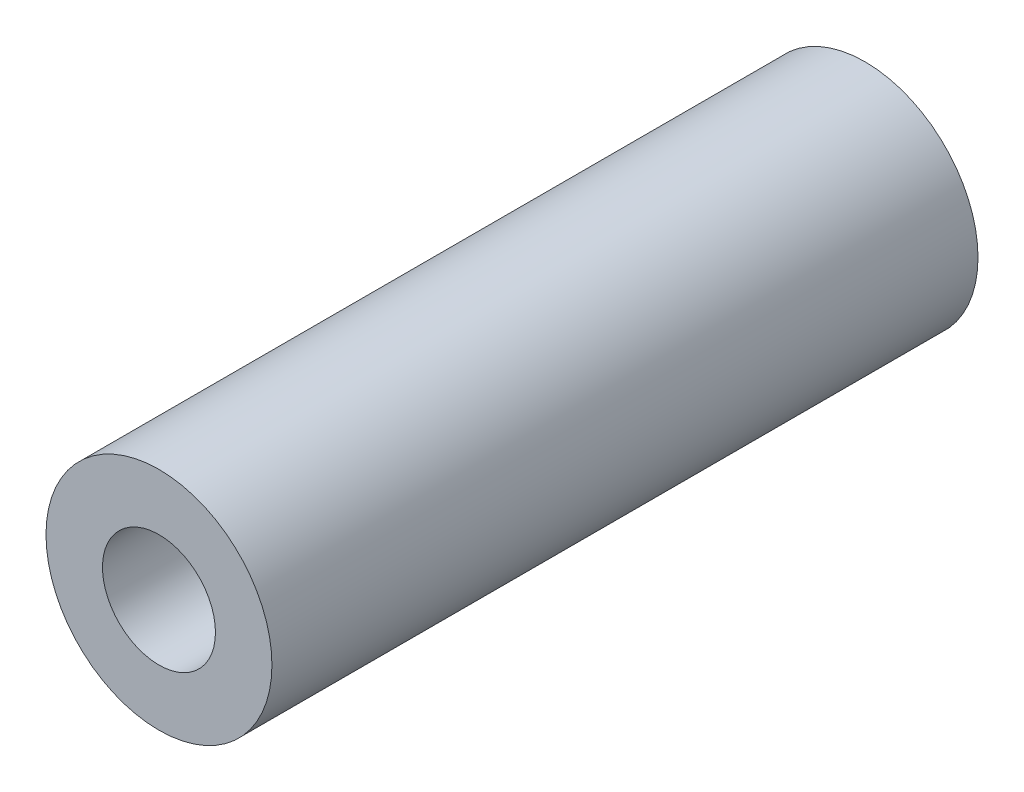
ISO-10303-21;
HEADER;
FILE_DESCRIPTION(('STEP AP214'),'2;1');
FILE_NAME('part.step','',(''),(''),'','','');
FILE_SCHEMA(('AUTOMOTIVE_DESIGN { 1 0 10303 214 1 1 1 1 }'));
ENDSEC;
DATA;
#1=APPLICATION_CONTEXT('core data for automotive mechanical design processes');
#2=APPLICATION_PROTOCOL_DEFINITION('international standard','automotive_design',2000,#1);
#3=PRODUCT_CONTEXT('',#1,'mechanical');
#4=PRODUCT('Part','Part','',(#3));
#5=PRODUCT_RELATED_PRODUCT_CATEGORY('part','',(#4));
#6=PRODUCT_DEFINITION_FORMATION('','',#4);
#7=PRODUCT_DEFINITION_CONTEXT('part definition',#1,'design');
#8=PRODUCT_DEFINITION('design','',#6,#7);
#9=PRODUCT_DEFINITION_SHAPE('','',#8);
#10=(LENGTH_UNIT() NAMED_UNIT(*) SI_UNIT(.MILLI.,.METRE.));
#11=(NAMED_UNIT(*) PLANE_ANGLE_UNIT() SI_UNIT($,.RADIAN.));
#12=(NAMED_UNIT(*) SI_UNIT($,.STERADIAN.) SOLID_ANGLE_UNIT());
#13=UNCERTAINTY_MEASURE_WITH_UNIT(LENGTH_MEASURE(1.E-05),#10,'distance_accuracy_value','');
#14=(GEOMETRIC_REPRESENTATION_CONTEXT(3) GLOBAL_UNCERTAINTY_ASSIGNED_CONTEXT((#13)) GLOBAL_UNIT_ASSIGNED_CONTEXT((#10,
#11,#12)) REPRESENTATION_CONTEXT('',''));
#15=CARTESIAN_POINT('',(0.,0.,0.));
#16=DIRECTION('',(0.,0.,1.));
#17=DIRECTION('',(1.,0.,0.));
#18=AXIS2_PLACEMENT_3D('',#15,#16,#17);
#19=CARTESIAN_POINT('',(0.,0.,50.));
#20=DIRECTION('',(0.,0.,-1.));
#21=DIRECTION('',(-1.,0.,0.));
#22=AXIS2_PLACEMENT_3D('',#19,#20,#21);
#23=CYLINDRICAL_SURFACE('',#22,8.);
#24=CARTESIAN_POINT('',(0.,0.,50.));
#25=DIRECTION('',(0.,0.,1.));
#26=DIRECTION('',(1.,0.,0.));
#27=AXIS2_PLACEMENT_3D('',#24,#25,#26);
#28=CIRCLE('',#27,8.);
#29=CARTESIAN_POINT('',(8.,0.,50.));
#30=VERTEX_POINT('',#29);
#31=EDGE_CURVE('E10',#30,#30,#28,.T.);
#32=ORIENTED_EDGE('',*,*,#31,.F.);
#33=EDGE_LOOP('',(#32));
#34=FACE_BOUND('',#33,.T.);
#35=CARTESIAN_POINT('',(0.,0.,0.));
#36=DIRECTION('',(0.,0.,1.));
#37=DIRECTION('',(1.,0.,0.));
#38=AXIS2_PLACEMENT_3D('',#35,#36,#37);
#39=CIRCLE('',#38,8.);
#40=CARTESIAN_POINT('',(8.,0.,0.));
#41=VERTEX_POINT('',#40);
#42=EDGE_CURVE('E39',#41,#41,#39,.T.);
#43=ORIENTED_EDGE('',*,*,#42,.T.);
#44=EDGE_LOOP('',(#43));
#45=FACE_BOUND('',#44,.T.);
#46=ADVANCED_FACE('F36',(#34,#45),#23,.T.);
#47=CARTESIAN_POINT('',(0.,0.,50.));
#48=DIRECTION('',(0.,0.,1.));
#49=DIRECTION('',(1.,0.,0.));
#50=AXIS2_PLACEMENT_3D('',#47,#48,#49);
#51=PLANE('',#50);
#52=CARTESIAN_POINT('',(0.,0.,50.));
#53=DIRECTION('',(0.,0.,1.));
#54=DIRECTION('',(1.,0.,0.));
#55=AXIS2_PLACEMENT_3D('',#52,#53,#54);
#56=CIRCLE('',#55,4.);
#57=CARTESIAN_POINT('',(4.,0.,50.));
#58=VERTEX_POINT('',#57);
#59=EDGE_CURVE('E50',#58,#58,#56,.T.);
#60=ORIENTED_EDGE('',*,*,#59,.F.);
#61=EDGE_LOOP('',(#60));
#62=FACE_BOUND('',#61,.T.);
#63=ORIENTED_EDGE('',*,*,#31,.T.);
#64=EDGE_LOOP('',(#63));
#65=FACE_BOUND('',#64,.T.);
#66=ADVANCED_FACE('F67',(#62,#65),#51,.T.);
#67=CARTESIAN_POINT('',(0.,0.,0.));
#68=DIRECTION('',(0.,0.,1.));
#69=DIRECTION('',(1.,0.,0.));
#70=AXIS2_PLACEMENT_3D('',#67,#68,#69);
#71=PLANE('',#70);
#72=ORIENTED_EDGE('',*,*,#42,.F.);
#73=EDGE_LOOP('',(#72));
#74=FACE_BOUND('',#73,.T.);
#75=ADVANCED_FACE('F63',(#74),#71,.F.);
#76=CARTESIAN_POINT('',(0.,0.,20.));
#77=DIRECTION('',(0.,0.,1.));
#78=DIRECTION('',(1.,0.,0.));
#79=AXIS2_PLACEMENT_3D('',#76,#77,#78);
#80=CYLINDRICAL_SURFACE('',#79,4.);
#81=CARTESIAN_POINT('',(0.,0.,20.));
#82=DIRECTION('',(0.,0.,1.));
#83=DIRECTION('',(1.,0.,0.));
#84=AXIS2_PLACEMENT_3D('',#81,#82,#83);
#85=CIRCLE('',#84,4.);
#86=CARTESIAN_POINT('',(4.,0.,20.));
#87=VERTEX_POINT('',#86);
#88=EDGE_CURVE('E48',#87,#87,#85,.T.);
#89=ORIENTED_EDGE('',*,*,#88,.F.);
#90=EDGE_LOOP('',(#89));
#91=FACE_BOUND('',#90,.T.);
#92=ORIENTED_EDGE('',*,*,#59,.T.);
#93=EDGE_LOOP('',(#92));
#94=FACE_BOUND('',#93,.T.);
#95=ADVANCED_FACE('F60',(#91,#94),#80,.F.);
#96=CARTESIAN_POINT('',(0.,0.,20.));
#97=DIRECTION('',(0.,0.,1.));
#98=DIRECTION('',(1.,0.,0.));
#99=AXIS2_PLACEMENT_3D('',#96,#97,#98);
#100=PLANE('',#99);
#101=ORIENTED_EDGE('',*,*,#88,.T.);
#102=EDGE_LOOP('',(#101));
#103=FACE_BOUND('',#102,.T.);
#104=ADVANCED_FACE('F58',(#103),#100,.T.);
#105=CLOSED_SHELL('',(#46,#66,#75,#95,#104));
#106=MANIFOLD_SOLID_BREP('B2',#105);
#107=ADVANCED_BREP_SHAPE_REPRESENTATION('',(#18,#106),#14);
#108=SHAPE_DEFINITION_REPRESENTATION(#9,#107);
ENDSEC;
END-ISO-10303-21;
